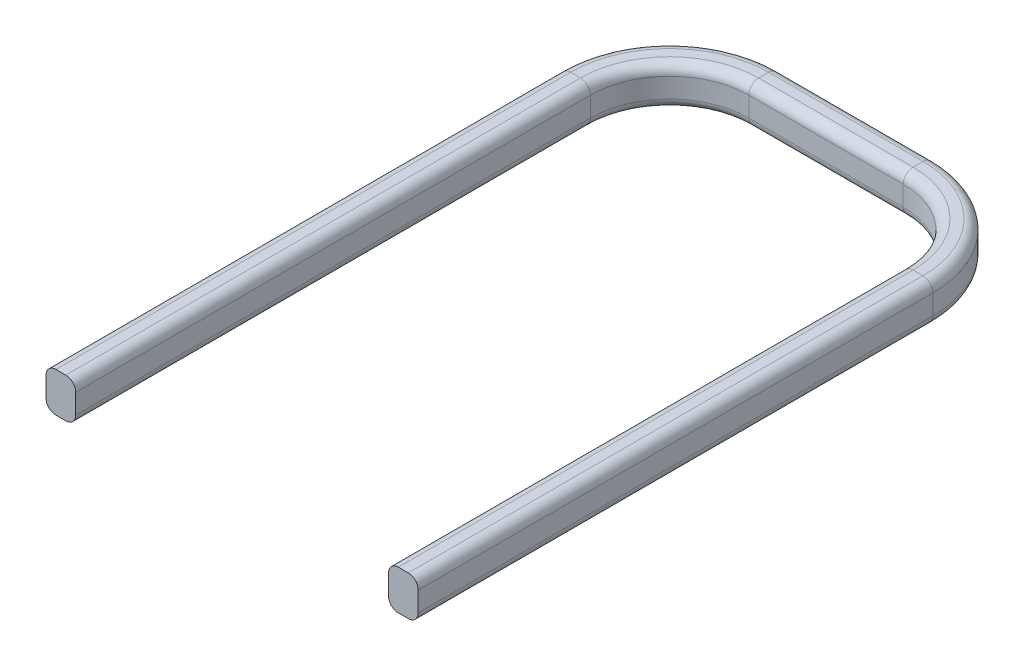
ISO-10303-21;
HEADER;
FILE_DESCRIPTION(('STEP AP214'),'2;1');
FILE_NAME('part.step','',(''),(''),'','','');
FILE_SCHEMA(('AUTOMOTIVE_DESIGN { 1 0 10303 214 1 1 1 1 }'));
ENDSEC;
DATA;
#1=APPLICATION_CONTEXT('core data for automotive mechanical design processes');
#2=APPLICATION_PROTOCOL_DEFINITION('international standard','automotive_design',2000,#1);
#3=PRODUCT_CONTEXT('',#1,'mechanical');
#4=PRODUCT('Part','Part','',(#3));
#5=PRODUCT_RELATED_PRODUCT_CATEGORY('part','',(#4));
#6=PRODUCT_DEFINITION_FORMATION('','',#4);
#7=PRODUCT_DEFINITION_CONTEXT('part definition',#1,'design');
#8=PRODUCT_DEFINITION('design','',#6,#7);
#9=PRODUCT_DEFINITION_SHAPE('','',#8);
#10=(LENGTH_UNIT() NAMED_UNIT(*) SI_UNIT(.MILLI.,.METRE.));
#11=(NAMED_UNIT(*) PLANE_ANGLE_UNIT() SI_UNIT($,.RADIAN.));
#12=(NAMED_UNIT(*) SI_UNIT($,.STERADIAN.) SOLID_ANGLE_UNIT());
#13=UNCERTAINTY_MEASURE_WITH_UNIT(LENGTH_MEASURE(1.E-05),#10,'distance_accuracy_value','');
#14=(GEOMETRIC_REPRESENTATION_CONTEXT(3) GLOBAL_UNCERTAINTY_ASSIGNED_CONTEXT((#13)) GLOBAL_UNIT_ASSIGNED_CONTEXT((#10,
#11,#12)) REPRESENTATION_CONTEXT('',''));
#15=CARTESIAN_POINT('',(0.,0.,0.));
#16=DIRECTION('',(0.,0.,1.));
#17=DIRECTION('',(1.,0.,0.));
#18=AXIS2_PLACEMENT_3D('',#15,#16,#17);
#19=CARTESIAN_POINT('',(0.,0.,0.));
#20=DIRECTION('',(0.,0.,1.));
#21=DIRECTION('',(1.,0.,0.));
#22=AXIS2_PLACEMENT_3D('',#19,#20,#21);
#23=PLANE('',#22);
#24=DIRECTION('',(1.,0.,0.));
#25=VECTOR('',#24,1.);
#26=CARTESIAN_POINT('',(-3.95,0.,0.));
#27=LINE('',#26,#25);
#28=CARTESIAN_POINT('',(-4.45,0.,0.));
#29=VERTEX_POINT('',#28);
#30=CARTESIAN_POINT('',(-4.2,0.,0.));
#31=VERTEX_POINT('',#30);
#32=EDGE_CURVE('E389',#29,#31,#27,.T.);
#33=ORIENTED_EDGE('',*,*,#32,.T.);
#34=CARTESIAN_POINT('',(-4.2,0.25,0.));
#35=DIRECTION('',(0.,0.,1.));
#36=DIRECTION('',(1.,0.,0.));
#37=AXIS2_PLACEMENT_3D('',#34,#35,#36);
#38=CIRCLE('',#37,0.25);
#39=CARTESIAN_POINT('',(-3.95,0.25,0.));
#40=VERTEX_POINT('',#39);
#41=EDGE_CURVE('E319',#31,#40,#38,.T.);
#42=ORIENTED_EDGE('',*,*,#41,.T.);
#43=DIRECTION('',(0.,1.,0.));
#44=VECTOR('',#43,1.);
#45=CARTESIAN_POINT('',(-3.95,0.,0.));
#46=LINE('',#45,#44);
#47=CARTESIAN_POINT('',(-3.95,0.75,0.));
#48=VERTEX_POINT('',#47);
#49=EDGE_CURVE('E332',#40,#48,#46,.T.);
#50=ORIENTED_EDGE('',*,*,#49,.T.);
#51=CARTESIAN_POINT('',(-4.2,0.75,0.));
#52=DIRECTION('',(0.,0.,1.));
#53=DIRECTION('',(1.,0.,0.));
#54=AXIS2_PLACEMENT_3D('',#51,#52,#53);
#55=CIRCLE('',#54,0.25);
#56=CARTESIAN_POINT('',(-4.2,1.,0.));
#57=VERTEX_POINT('',#56);
#58=EDGE_CURVE('E315',#48,#57,#55,.T.);
#59=ORIENTED_EDGE('',*,*,#58,.T.);
#60=DIRECTION('',(-1.,0.,0.));
#61=VECTOR('',#60,1.);
#62=CARTESIAN_POINT('',(-3.95,1.,0.));
#63=LINE('',#62,#61);
#64=CARTESIAN_POINT('',(-4.45,1.,0.));
#65=VERTEX_POINT('',#64);
#66=EDGE_CURVE('E380',#57,#65,#63,.T.);
#67=ORIENTED_EDGE('',*,*,#66,.T.);
#68=CARTESIAN_POINT('',(-4.45,0.75,0.));
#69=DIRECTION('',(0.,0.,1.));
#70=DIRECTION('',(1.,0.,0.));
#71=AXIS2_PLACEMENT_3D('',#68,#69,#70);
#72=CIRCLE('',#71,0.25);
#73=CARTESIAN_POINT('',(-4.7,0.75,0.));
#74=VERTEX_POINT('',#73);
#75=EDGE_CURVE('E57',#65,#74,#72,.T.);
#76=ORIENTED_EDGE('',*,*,#75,.T.);
#77=DIRECTION('',(0.,-1.,0.));
#78=VECTOR('',#77,1.);
#79=CARTESIAN_POINT('',(-4.7,0.,0.));
#80=LINE('',#79,#78);
#81=CARTESIAN_POINT('',(-4.7,0.25,0.));
#82=VERTEX_POINT('',#81);
#83=EDGE_CURVE('E387',#74,#82,#80,.T.);
#84=ORIENTED_EDGE('',*,*,#83,.T.);
#85=CARTESIAN_POINT('',(-4.45,0.25,0.));
#86=DIRECTION('',(0.,0.,1.));
#87=DIRECTION('',(1.,0.,0.));
#88=AXIS2_PLACEMENT_3D('',#85,#86,#87);
#89=CIRCLE('',#88,0.25);
#90=EDGE_CURVE('E317',#82,#29,#89,.T.);
#91=ORIENTED_EDGE('',*,*,#90,.T.);
#92=EDGE_LOOP('',(#33,#42,#50,#59,#67,#76,#84,#91));
#93=FACE_BOUND('',#92,.T.);
#94=ADVANCED_FACE('F33',(#93),#23,.T.);
#95=CARTESIAN_POINT('',(0.,0.,0.));
#96=DIRECTION('',(0.,0.,-1.));
#97=DIRECTION('',(-1.,0.,0.));
#98=AXIS2_PLACEMENT_3D('',#95,#96,#97);
#99=PLANE('',#98);
#100=DIRECTION('',(0.,1.,0.));
#101=VECTOR('',#100,1.);
#102=CARTESIAN_POINT('',(3.95,0.,0.));
#103=LINE('',#102,#101);
#104=CARTESIAN_POINT('',(3.95,0.25,0.));
#105=VERTEX_POINT('',#104);
#106=CARTESIAN_POINT('',(3.95,0.75,0.));
#107=VERTEX_POINT('',#106);
#108=EDGE_CURVE('E394',#105,#107,#103,.T.);
#109=ORIENTED_EDGE('',*,*,#108,.F.);
#110=CARTESIAN_POINT('',(4.2,0.25,0.));
#111=DIRECTION('',(0.,0.,-1.));
#112=DIRECTION('',(-1.,0.,0.));
#113=AXIS2_PLACEMENT_3D('',#110,#111,#112);
#114=CIRCLE('',#113,0.25);
#115=CARTESIAN_POINT('',(4.2,0.,0.));
#116=VERTEX_POINT('',#115);
#117=EDGE_CURVE('E235',#105,#116,#114,.F.);
#118=ORIENTED_EDGE('',*,*,#117,.T.);
#119=DIRECTION('',(-1.,0.,0.));
#120=VECTOR('',#119,1.);
#121=CARTESIAN_POINT('',(3.95,0.,0.));
#122=LINE('',#121,#120);
#123=CARTESIAN_POINT('',(4.45,0.,0.));
#124=VERTEX_POINT('',#123);
#125=EDGE_CURVE('E240',#124,#116,#122,.T.);
#126=ORIENTED_EDGE('',*,*,#125,.F.);
#127=CARTESIAN_POINT('',(4.45,0.25,0.));
#128=DIRECTION('',(0.,0.,-1.));
#129=DIRECTION('',(-1.,0.,0.));
#130=AXIS2_PLACEMENT_3D('',#127,#128,#129);
#131=CIRCLE('',#130,0.25);
#132=CARTESIAN_POINT('',(4.7,0.25,0.));
#133=VERTEX_POINT('',#132);
#134=EDGE_CURVE('E245',#124,#133,#131,.F.);
#135=ORIENTED_EDGE('',*,*,#134,.T.);
#136=DIRECTION('',(0.,-1.,0.));
#137=VECTOR('',#136,1.);
#138=CARTESIAN_POINT('',(4.7,0.,0.));
#139=LINE('',#138,#137);
#140=CARTESIAN_POINT('',(4.7,0.75,0.));
#141=VERTEX_POINT('',#140);
#142=EDGE_CURVE('E412',#141,#133,#139,.T.);
#143=ORIENTED_EDGE('',*,*,#142,.F.);
#144=CARTESIAN_POINT('',(4.45,0.75,0.));
#145=DIRECTION('',(0.,0.,-1.));
#146=DIRECTION('',(-1.,0.,0.));
#147=AXIS2_PLACEMENT_3D('',#144,#145,#146);
#148=CIRCLE('',#147,0.25);
#149=CARTESIAN_POINT('',(4.45,1.,0.));
#150=VERTEX_POINT('',#149);
#151=EDGE_CURVE('E236',#141,#150,#148,.F.);
#152=ORIENTED_EDGE('',*,*,#151,.T.);
#153=DIRECTION('',(1.,0.,0.));
#154=VECTOR('',#153,1.);
#155=CARTESIAN_POINT('',(3.95,1.,0.));
#156=LINE('',#155,#154);
#157=CARTESIAN_POINT('',(4.2,1.,0.));
#158=VERTEX_POINT('',#157);
#159=EDGE_CURVE('E410',#158,#150,#156,.T.);
#160=ORIENTED_EDGE('',*,*,#159,.F.);
#161=CARTESIAN_POINT('',(4.2,0.75,0.));
#162=DIRECTION('',(0.,0.,-1.));
#163=DIRECTION('',(-1.,0.,0.));
#164=AXIS2_PLACEMENT_3D('',#161,#162,#163);
#165=CIRCLE('',#164,0.25);
#166=EDGE_CURVE('E238',#158,#107,#165,.F.);
#167=ORIENTED_EDGE('',*,*,#166,.T.);
#168=EDGE_LOOP('',(#109,#118,#126,#135,#143,#152,#160,#167));
#169=FACE_BOUND('',#168,.T.);
#170=ADVANCED_FACE('F441',(#169),#99,.F.);
#171=CARTESIAN_POINT('',(-3.95,0.,0.));
#172=DIRECTION('',(-1.,0.,0.));
#173=DIRECTION('',(0.,0.,1.));
#174=AXIS2_PLACEMENT_3D('',#171,#172,#173);
#175=PLANE('',#174);
#176=ORIENTED_EDGE('',*,*,#49,.F.);
#177=DIRECTION('',(0.,0.,-1.));
#178=VECTOR('',#177,1.);
#179=CARTESIAN_POINT('',(-3.95,0.25,0.));
#180=LINE('',#179,#178);
#181=CARTESIAN_POINT('',(-3.95,0.25,-13.));
#182=VERTEX_POINT('',#181);
#183=EDGE_CURVE('E308',#40,#182,#180,.T.);
#184=ORIENTED_EDGE('',*,*,#183,.T.);
#185=DIRECTION('',(0.,1.,0.));
#186=VECTOR('',#185,1.);
#187=CARTESIAN_POINT('',(-3.95,0.,-13.));
#188=LINE('',#187,#186);
#189=CARTESIAN_POINT('',(-3.95,0.75,-13.));
#190=VERTEX_POINT('',#189);
#191=EDGE_CURVE('E397',#182,#190,#188,.T.);
#192=ORIENTED_EDGE('',*,*,#191,.T.);
#193=DIRECTION('',(0.,0.,-1.));
#194=VECTOR('',#193,1.);
#195=CARTESIAN_POINT('',(-3.95,0.75,0.));
#196=LINE('',#195,#194);
#197=EDGE_CURVE('E306',#190,#48,#196,.F.);
#198=ORIENTED_EDGE('',*,*,#197,.T.);
#199=EDGE_LOOP('',(#176,#184,#192,#198));
#200=FACE_BOUND('',#199,.T.);
#201=ADVANCED_FACE('F476',(#200),#175,.F.);
#202=CARTESIAN_POINT('',(-3.95,1.,0.));
#203=DIRECTION('',(0.,-1.,0.));
#204=DIRECTION('',(1.,0.,0.));
#205=AXIS2_PLACEMENT_3D('',#202,#203,#204);
#206=PLANE('',#205);
#207=ORIENTED_EDGE('',*,*,#66,.F.);
#208=DIRECTION('',(0.,0.,-1.));
#209=VECTOR('',#208,1.);
#210=CARTESIAN_POINT('',(-4.2,1.,0.));
#211=LINE('',#210,#209);
#212=CARTESIAN_POINT('',(-4.2,1.,-13.));
#213=VERTEX_POINT('',#212);
#214=EDGE_CURVE('E11',#57,#213,#211,.T.);
#215=ORIENTED_EDGE('',*,*,#214,.T.);
#216=DIRECTION('',(-1.,0.,0.));
#217=VECTOR('',#216,1.);
#218=CARTESIAN_POINT('',(-3.95,1.,-13.));
#219=LINE('',#218,#217);
#220=CARTESIAN_POINT('',(-4.45,1.,-13.));
#221=VERTEX_POINT('',#220);
#222=EDGE_CURVE('E383',#213,#221,#219,.T.);
#223=ORIENTED_EDGE('',*,*,#222,.T.);
#224=DIRECTION('',(0.,0.,-1.));
#225=VECTOR('',#224,1.);
#226=CARTESIAN_POINT('',(-4.45,1.,0.));
#227=LINE('',#226,#225);
#228=EDGE_CURVE('E42',#221,#65,#227,.F.);
#229=ORIENTED_EDGE('',*,*,#228,.T.);
#230=EDGE_LOOP('',(#207,#215,#223,#229));
#231=FACE_BOUND('',#230,.T.);
#232=ADVANCED_FACE('F379',(#231),#206,.F.);
#233=CARTESIAN_POINT('',(-4.7,0.,0.));
#234=DIRECTION('',(1.,0.,0.));
#235=DIRECTION('',(0.,0.,-1.));
#236=AXIS2_PLACEMENT_3D('',#233,#234,#235);
#237=PLANE('',#236);
#238=DIRECTION('',(0.,-1.,0.));
#239=VECTOR('',#238,1.);
#240=CARTESIAN_POINT('',(-4.7,0.,-13.));
#241=LINE('',#240,#239);
#242=CARTESIAN_POINT('',(-4.7,0.75,-13.));
#243=VERTEX_POINT('',#242);
#244=CARTESIAN_POINT('',(-4.7,0.25,-13.));
#245=VERTEX_POINT('',#244);
#246=EDGE_CURVE('E396',#243,#245,#241,.T.);
#247=ORIENTED_EDGE('',*,*,#246,.T.);
#248=DIRECTION('',(0.,0.,-1.));
#249=VECTOR('',#248,1.);
#250=CARTESIAN_POINT('',(-4.7,0.25,0.));
#251=LINE('',#250,#249);
#252=EDGE_CURVE('E50',#245,#82,#251,.F.);
#253=ORIENTED_EDGE('',*,*,#252,.T.);
#254=ORIENTED_EDGE('',*,*,#83,.F.);
#255=DIRECTION('',(0.,0.,-1.));
#256=VECTOR('',#255,1.);
#257=CARTESIAN_POINT('',(-4.7,0.75,0.));
#258=LINE('',#257,#256);
#259=EDGE_CURVE('E321',#74,#243,#258,.T.);
#260=ORIENTED_EDGE('',*,*,#259,.T.);
#261=EDGE_LOOP('',(#247,#253,#254,#260));
#262=FACE_BOUND('',#261,.T.);
#263=ADVANCED_FACE('F526',(#262),#237,.F.);
#264=CARTESIAN_POINT('',(-3.95,0.,0.));
#265=DIRECTION('',(0.,1.,0.));
#266=DIRECTION('',(-1.,0.,0.));
#267=AXIS2_PLACEMENT_3D('',#264,#265,#266);
#268=PLANE('',#267);
#269=DIRECTION('',(1.,0.,0.));
#270=VECTOR('',#269,1.);
#271=CARTESIAN_POINT('',(-3.95,0.,-13.));
#272=LINE('',#271,#270);
#273=CARTESIAN_POINT('',(-4.45,0.,-13.));
#274=VERTEX_POINT('',#273);
#275=CARTESIAN_POINT('',(-4.2,0.,-13.));
#276=VERTEX_POINT('',#275);
#277=EDGE_CURVE('E415',#274,#276,#272,.T.);
#278=ORIENTED_EDGE('',*,*,#277,.T.);
#279=DIRECTION('',(0.,0.,-1.));
#280=VECTOR('',#279,1.);
#281=CARTESIAN_POINT('',(-4.2,0.,0.));
#282=LINE('',#281,#280);
#283=EDGE_CURVE('E312',#276,#31,#282,.F.);
#284=ORIENTED_EDGE('',*,*,#283,.T.);
#285=ORIENTED_EDGE('',*,*,#32,.F.);
#286=DIRECTION('',(0.,0.,-1.));
#287=VECTOR('',#286,1.);
#288=CARTESIAN_POINT('',(-4.45,0.,0.));
#289=LINE('',#288,#287);
#290=EDGE_CURVE('E310',#29,#274,#289,.T.);
#291=ORIENTED_EDGE('',*,*,#290,.T.);
#292=EDGE_LOOP('',(#278,#284,#285,#291));
#293=FACE_BOUND('',#292,.T.);
#294=ADVANCED_FACE('F534',(#293),#268,.F.);
#295=CARTESIAN_POINT('',(-1.95,0.,-13.));
#296=DIRECTION('',(0.,-1.,0.));
#297=DIRECTION('',(0.,0.,-1.));
#298=AXIS2_PLACEMENT_3D('',#295,#296,#297);
#299=CYLINDRICAL_SURFACE('',#298,2.);
#300=ORIENTED_EDGE('',*,*,#191,.F.);
#301=CARTESIAN_POINT('',(-1.95,0.25,-13.));
#302=DIRECTION('',(0.,1.,0.));
#303=DIRECTION('',(0.,0.,1.));
#304=AXIS2_PLACEMENT_3D('',#301,#302,#303);
#305=CIRCLE('',#304,2.);
#306=CARTESIAN_POINT('',(-1.95,0.25,-15.));
#307=VERTEX_POINT('',#306);
#308=EDGE_CURVE('E266',#182,#307,#305,.F.);
#309=ORIENTED_EDGE('',*,*,#308,.T.);
#310=DIRECTION('',(0.,1.,0.));
#311=VECTOR('',#310,1.);
#312=CARTESIAN_POINT('',(-1.95,0.,-15.));
#313=LINE('',#312,#311);
#314=CARTESIAN_POINT('',(-1.95,0.75,-15.));
#315=VERTEX_POINT('',#314);
#316=EDGE_CURVE('E402',#307,#315,#313,.T.);
#317=ORIENTED_EDGE('',*,*,#316,.T.);
#318=CARTESIAN_POINT('',(-1.95,0.75,-13.));
#319=DIRECTION('',(0.,-1.,0.));
#320=DIRECTION('',(0.,0.,-1.));
#321=AXIS2_PLACEMENT_3D('',#318,#319,#320);
#322=CIRCLE('',#321,2.);
#323=EDGE_CURVE('E264',#315,#190,#322,.F.);
#324=ORIENTED_EDGE('',*,*,#323,.T.);
#325=EDGE_LOOP('',(#300,#309,#317,#324));
#326=FACE_BOUND('',#325,.T.);
#327=ADVANCED_FACE('F471',(#326),#299,.F.);
#328=CARTESIAN_POINT('',(-3.95,1.,-13.));
#329=DIRECTION('',(0.,-1.,0.));
#330=DIRECTION('',(0.,0.,-1.));
#331=AXIS2_PLACEMENT_3D('',#328,#329,#330);
#332=PLANE('',#331);
#333=ORIENTED_EDGE('',*,*,#222,.F.);
#334=CARTESIAN_POINT('',(-1.95,1.,-13.));
#335=DIRECTION('',(0.,-1.,0.));
#336=DIRECTION('',(0.,0.,-1.));
#337=AXIS2_PLACEMENT_3D('',#334,#335,#336);
#338=CIRCLE('',#337,2.25);
#339=CARTESIAN_POINT('',(-1.95,1.,-15.25));
#340=VERTEX_POINT('',#339);
#341=EDGE_CURVE('E304',#213,#340,#338,.T.);
#342=ORIENTED_EDGE('',*,*,#341,.T.);
#343=DIRECTION('',(0.,0.,-1.));
#344=VECTOR('',#343,1.);
#345=CARTESIAN_POINT('',(-1.95,1.,-15.));
#346=LINE('',#345,#344);
#347=CARTESIAN_POINT('',(-1.95,1.,-15.5));
#348=VERTEX_POINT('',#347);
#349=EDGE_CURVE('E398',#340,#348,#346,.T.);
#350=ORIENTED_EDGE('',*,*,#349,.T.);
#351=CARTESIAN_POINT('',(-1.95,1.,-13.));
#352=DIRECTION('',(0.,-1.,0.));
#353=DIRECTION('',(0.,0.,-1.));
#354=AXIS2_PLACEMENT_3D('',#351,#352,#353);
#355=CIRCLE('',#354,2.5);
#356=EDGE_CURVE('E302',#348,#221,#355,.F.);
#357=ORIENTED_EDGE('',*,*,#356,.T.);
#358=EDGE_LOOP('',(#333,#342,#350,#357));
#359=FACE_BOUND('',#358,.T.);
#360=ADVANCED_FACE('F482',(#359),#332,.F.);
#361=CARTESIAN_POINT('',(-1.95,0.,-13.));
#362=DIRECTION('',(0.,-1.,0.));
#363=DIRECTION('',(0.,0.,-1.));
#364=AXIS2_PLACEMENT_3D('',#361,#362,#363);
#365=CYLINDRICAL_SURFACE('',#364,2.75);
#366=DIRECTION('',(0.,-1.,0.));
#367=VECTOR('',#366,1.);
#368=CARTESIAN_POINT('',(-1.95,0.,-15.75));
#369=LINE('',#368,#367);
#370=CARTESIAN_POINT('',(-1.95,0.75,-15.75));
#371=VERTEX_POINT('',#370);
#372=CARTESIAN_POINT('',(-1.95,0.25,-15.75));
#373=VERTEX_POINT('',#372);
#374=EDGE_CURVE('E401',#371,#373,#369,.T.);
#375=ORIENTED_EDGE('',*,*,#374,.T.);
#376=CARTESIAN_POINT('',(-1.95,0.25,-13.));
#377=DIRECTION('',(0.,1.,0.));
#378=DIRECTION('',(0.,0.,1.));
#379=AXIS2_PLACEMENT_3D('',#376,#377,#378);
#380=CIRCLE('',#379,2.75);
#381=EDGE_CURVE('E287',#373,#245,#380,.T.);
#382=ORIENTED_EDGE('',*,*,#381,.T.);
#383=ORIENTED_EDGE('',*,*,#246,.F.);
#384=CARTESIAN_POINT('',(-1.95,0.75,-13.));
#385=DIRECTION('',(0.,-1.,0.));
#386=DIRECTION('',(0.,0.,-1.));
#387=AXIS2_PLACEMENT_3D('',#384,#385,#386);
#388=CIRCLE('',#387,2.75);
#389=EDGE_CURVE('E285',#243,#371,#388,.T.);
#390=ORIENTED_EDGE('',*,*,#389,.T.);
#391=EDGE_LOOP('',(#375,#382,#383,#390));
#392=FACE_BOUND('',#391,.T.);
#393=ADVANCED_FACE('F525',(#392),#365,.T.);
#394=CARTESIAN_POINT('',(-3.95,0.,-13.));
#395=DIRECTION('',(0.,1.,0.));
#396=DIRECTION('',(0.,0.,1.));
#397=AXIS2_PLACEMENT_3D('',#394,#395,#396);
#398=PLANE('',#397);
#399=DIRECTION('',(0.,0.,1.));
#400=VECTOR('',#399,1.);
#401=CARTESIAN_POINT('',(-1.95,0.,-15.));
#402=LINE('',#401,#400);
#403=CARTESIAN_POINT('',(-1.95,0.,-15.5));
#404=VERTEX_POINT('',#403);
#405=CARTESIAN_POINT('',(-1.95,0.,-15.25));
#406=VERTEX_POINT('',#405);
#407=EDGE_CURVE('E418',#404,#406,#402,.T.);
#408=ORIENTED_EDGE('',*,*,#407,.T.);
#409=CARTESIAN_POINT('',(-1.95,0.,-13.));
#410=DIRECTION('',(0.,1.,0.));
#411=DIRECTION('',(0.,0.,1.));
#412=AXIS2_PLACEMENT_3D('',#409,#410,#411);
#413=CIRCLE('',#412,2.25);
#414=EDGE_CURVE('E270',#406,#276,#413,.T.);
#415=ORIENTED_EDGE('',*,*,#414,.T.);
#416=ORIENTED_EDGE('',*,*,#277,.F.);
#417=CARTESIAN_POINT('',(-1.95,0.,-13.));
#418=DIRECTION('',(0.,1.,0.));
#419=DIRECTION('',(0.,0.,1.));
#420=AXIS2_PLACEMENT_3D('',#417,#418,#419);
#421=CIRCLE('',#420,2.5);
#422=EDGE_CURVE('E268',#274,#404,#421,.F.);
#423=ORIENTED_EDGE('',*,*,#422,.T.);
#424=EDGE_LOOP('',(#408,#415,#416,#423));
#425=FACE_BOUND('',#424,.T.);
#426=ADVANCED_FACE('F553',(#425),#398,.F.);
#427=CARTESIAN_POINT('',(-1.95,0.,-15.));
#428=DIRECTION('',(0.,0.,-1.));
#429=DIRECTION('',(-1.,0.,0.));
#430=AXIS2_PLACEMENT_3D('',#427,#428,#429);
#431=PLANE('',#430);
#432=ORIENTED_EDGE('',*,*,#316,.F.);
#433=DIRECTION('',(1.,0.,0.));
#434=VECTOR('',#433,1.);
#435=CARTESIAN_POINT('',(-1.95,0.25,-15.));
#436=LINE('',#435,#434);
#437=CARTESIAN_POINT('',(1.95,0.25,-15.));
#438=VERTEX_POINT('',#437);
#439=EDGE_CURVE('E258',#307,#438,#436,.T.);
#440=ORIENTED_EDGE('',*,*,#439,.T.);
#441=DIRECTION('',(0.,1.,0.));
#442=VECTOR('',#441,1.);
#443=CARTESIAN_POINT('',(1.95,0.,-15.));
#444=LINE('',#443,#442);
#445=CARTESIAN_POINT('',(1.95,0.75,-15.));
#446=VERTEX_POINT('',#445);
#447=EDGE_CURVE('E204',#438,#446,#444,.T.);
#448=ORIENTED_EDGE('',*,*,#447,.T.);
#449=DIRECTION('',(1.,0.,0.));
#450=VECTOR('',#449,1.);
#451=CARTESIAN_POINT('',(-1.95,0.75,-15.));
#452=LINE('',#451,#450);
#453=EDGE_CURVE('E256',#446,#315,#452,.F.);
#454=ORIENTED_EDGE('',*,*,#453,.T.);
#455=EDGE_LOOP('',(#432,#440,#448,#454));
#456=FACE_BOUND('',#455,.T.);
#457=ADVANCED_FACE('F455',(#456),#431,.F.);
#458=CARTESIAN_POINT('',(-1.95,1.,-15.));
#459=DIRECTION('',(0.,-1.,0.));
#460=DIRECTION('',(0.,0.,-1.));
#461=AXIS2_PLACEMENT_3D('',#458,#459,#460);
#462=PLANE('',#461);
#463=ORIENTED_EDGE('',*,*,#349,.F.);
#464=DIRECTION('',(1.,0.,0.));
#465=VECTOR('',#464,1.);
#466=CARTESIAN_POINT('',(-1.95,1.,-15.25));
#467=LINE('',#466,#465);
#468=CARTESIAN_POINT('',(1.95,1.,-15.25));
#469=VERTEX_POINT('',#468);
#470=EDGE_CURVE('E300',#340,#469,#467,.T.);
#471=ORIENTED_EDGE('',*,*,#470,.T.);
#472=DIRECTION('',(0.,0.,-1.));
#473=VECTOR('',#472,1.);
#474=CARTESIAN_POINT('',(1.95,1.,-15.));
#475=LINE('',#474,#473);
#476=CARTESIAN_POINT('',(1.95,1.,-15.5));
#477=VERTEX_POINT('',#476);
#478=EDGE_CURVE('E403',#469,#477,#475,.T.);
#479=ORIENTED_EDGE('',*,*,#478,.T.);
#480=DIRECTION('',(1.,0.,0.));
#481=VECTOR('',#480,1.);
#482=CARTESIAN_POINT('',(-1.95,1.,-15.5));
#483=LINE('',#482,#481);
#484=EDGE_CURVE('E298',#477,#348,#483,.F.);
#485=ORIENTED_EDGE('',*,*,#484,.T.);
#486=EDGE_LOOP('',(#463,#471,#479,#485));
#487=FACE_BOUND('',#486,.T.);
#488=ADVANCED_FACE('F485',(#487),#462,.F.);
#489=CARTESIAN_POINT('',(-1.95,0.,-15.75));
#490=DIRECTION('',(0.,0.,1.));
#491=DIRECTION('',(1.,0.,0.));
#492=AXIS2_PLACEMENT_3D('',#489,#490,#491);
#493=PLANE('',#492);
#494=DIRECTION('',(0.,-1.,0.));
#495=VECTOR('',#494,1.);
#496=CARTESIAN_POINT('',(1.95,0.,-15.75));
#497=LINE('',#496,#495);
#498=CARTESIAN_POINT('',(1.95,0.75,-15.75));
#499=VERTEX_POINT('',#498);
#500=CARTESIAN_POINT('',(1.95,0.25,-15.75));
#501=VERTEX_POINT('',#500);
#502=EDGE_CURVE('E406',#499,#501,#497,.T.);
#503=ORIENTED_EDGE('',*,*,#502,.T.);
#504=DIRECTION('',(1.,0.,0.));
#505=VECTOR('',#504,1.);
#506=CARTESIAN_POINT('',(-1.95,0.25,-15.75));
#507=LINE('',#506,#505);
#508=EDGE_CURVE('E283',#501,#373,#507,.F.);
#509=ORIENTED_EDGE('',*,*,#508,.T.);
#510=ORIENTED_EDGE('',*,*,#374,.F.);
#511=DIRECTION('',(1.,0.,0.));
#512=VECTOR('',#511,1.);
#513=CARTESIAN_POINT('',(-1.95,0.75,-15.75));
#514=LINE('',#513,#512);
#515=EDGE_CURVE('E281',#371,#499,#514,.T.);
#516=ORIENTED_EDGE('',*,*,#515,.T.);
#517=EDGE_LOOP('',(#503,#509,#510,#516));
#518=FACE_BOUND('',#517,.T.);
#519=ADVANCED_FACE('F512',(#518),#493,.F.);
#520=CARTESIAN_POINT('',(-1.95,0.,-15.));
#521=DIRECTION('',(0.,1.,0.));
#522=DIRECTION('',(0.,0.,1.));
#523=AXIS2_PLACEMENT_3D('',#520,#521,#522);
#524=PLANE('',#523);
#525=DIRECTION('',(0.,0.,1.));
#526=VECTOR('',#525,1.);
#527=CARTESIAN_POINT('',(1.95,0.,-15.));
#528=LINE('',#527,#526);
#529=CARTESIAN_POINT('',(1.95,0.,-15.5));
#530=VERTEX_POINT('',#529);
#531=CARTESIAN_POINT('',(1.95,0.,-15.25));
#532=VERTEX_POINT('',#531);
#533=EDGE_CURVE('E222',#530,#532,#528,.T.);
#534=ORIENTED_EDGE('',*,*,#533,.T.);
#535=DIRECTION('',(1.,0.,0.));
#536=VECTOR('',#535,1.);
#537=CARTESIAN_POINT('',(-1.95,0.,-15.25));
#538=LINE('',#537,#536);
#539=EDGE_CURVE('E262',#532,#406,#538,.F.);
#540=ORIENTED_EDGE('',*,*,#539,.T.);
#541=ORIENTED_EDGE('',*,*,#407,.F.);
#542=DIRECTION('',(1.,0.,0.));
#543=VECTOR('',#542,1.);
#544=CARTESIAN_POINT('',(-1.95,0.,-15.5));
#545=LINE('',#544,#543);
#546=EDGE_CURVE('E260',#404,#530,#545,.T.);
#547=ORIENTED_EDGE('',*,*,#546,.T.);
#548=EDGE_LOOP('',(#534,#540,#541,#547));
#549=FACE_BOUND('',#548,.T.);
#550=ADVANCED_FACE('F550',(#549),#524,.F.);
#551=CARTESIAN_POINT('',(1.95,0.,-13.));
#552=DIRECTION('',(0.,-1.,0.));
#553=DIRECTION('',(0.,0.,-1.));
#554=AXIS2_PLACEMENT_3D('',#551,#552,#553);
#555=CYLINDRICAL_SURFACE('',#554,2.);
#556=ORIENTED_EDGE('',*,*,#447,.F.);
#557=CARTESIAN_POINT('',(1.95,0.25,-13.));
#558=DIRECTION('',(0.,1.,0.));
#559=DIRECTION('',(0.,0.,1.));
#560=AXIS2_PLACEMENT_3D('',#557,#558,#559);
#561=CIRCLE('',#560,2.);
#562=CARTESIAN_POINT('',(3.95,0.25,-13.));
#563=VERTEX_POINT('',#562);
#564=EDGE_CURVE('E198',#438,#563,#561,.F.);
#565=ORIENTED_EDGE('',*,*,#564,.T.);
#566=DIRECTION('',(0.,1.,0.));
#567=VECTOR('',#566,1.);
#568=CARTESIAN_POINT('',(3.95,0.,-13.));
#569=LINE('',#568,#567);
#570=CARTESIAN_POINT('',(3.95,0.75,-13.));
#571=VERTEX_POINT('',#570);
#572=EDGE_CURVE('E201',#563,#571,#569,.T.);
#573=ORIENTED_EDGE('',*,*,#572,.T.);
#574=CARTESIAN_POINT('',(1.95,0.75,-13.));
#575=DIRECTION('',(0.,-1.,0.));
#576=DIRECTION('',(0.,0.,-1.));
#577=AXIS2_PLACEMENT_3D('',#574,#575,#576);
#578=CIRCLE('',#577,2.);
#579=EDGE_CURVE('E210',#571,#446,#578,.F.);
#580=ORIENTED_EDGE('',*,*,#579,.T.);
#581=EDGE_LOOP('',(#556,#565,#573,#580));
#582=FACE_BOUND('',#581,.T.);
#583=ADVANCED_FACE('F200',(#582),#555,.F.);
#584=CARTESIAN_POINT('',(1.95,1.,-15.));
#585=DIRECTION('',(0.,-1.,0.));
#586=DIRECTION('',(0.,0.,-1.));
#587=AXIS2_PLACEMENT_3D('',#584,#585,#586);
#588=PLANE('',#587);
#589=ORIENTED_EDGE('',*,*,#478,.F.);
#590=CARTESIAN_POINT('',(1.95,1.,-13.));
#591=DIRECTION('',(0.,-1.,0.));
#592=DIRECTION('',(0.,0.,-1.));
#593=AXIS2_PLACEMENT_3D('',#590,#591,#592);
#594=CIRCLE('',#593,2.25);
#595=CARTESIAN_POINT('',(4.2,1.,-13.));
#596=VERTEX_POINT('',#595);
#597=EDGE_CURVE('E296',#469,#596,#594,.T.);
#598=ORIENTED_EDGE('',*,*,#597,.T.);
#599=DIRECTION('',(1.,0.,0.));
#600=VECTOR('',#599,1.);
#601=CARTESIAN_POINT('',(3.95,1.,-13.));
#602=LINE('',#601,#600);
#603=CARTESIAN_POINT('',(4.45,1.,-13.));
#604=VERTEX_POINT('',#603);
#605=EDGE_CURVE('E221',#596,#604,#602,.T.);
#606=ORIENTED_EDGE('',*,*,#605,.T.);
#607=CARTESIAN_POINT('',(1.95,1.,-13.));
#608=DIRECTION('',(0.,-1.,0.));
#609=DIRECTION('',(0.,0.,-1.));
#610=AXIS2_PLACEMENT_3D('',#607,#608,#609);
#611=CIRCLE('',#610,2.5);
#612=EDGE_CURVE('E294',#604,#477,#611,.F.);
#613=ORIENTED_EDGE('',*,*,#612,.T.);
#614=EDGE_LOOP('',(#589,#598,#606,#613));
#615=FACE_BOUND('',#614,.T.);
#616=ADVANCED_FACE('F725',(#615),#588,.F.);
#617=CARTESIAN_POINT('',(1.95,0.,-13.));
#618=DIRECTION('',(0.,-1.,0.));
#619=DIRECTION('',(0.,0.,-1.));
#620=AXIS2_PLACEMENT_3D('',#617,#618,#619);
#621=CYLINDRICAL_SURFACE('',#620,2.75);
#622=DIRECTION('',(0.,-1.,0.));
#623=VECTOR('',#622,1.);
#624=CARTESIAN_POINT('',(4.7,0.,-13.));
#625=LINE('',#624,#623);
#626=CARTESIAN_POINT('',(4.7,0.75,-13.));
#627=VERTEX_POINT('',#626);
#628=CARTESIAN_POINT('',(4.7,0.25,-13.));
#629=VERTEX_POINT('',#628);
#630=EDGE_CURVE('E409',#627,#629,#625,.T.);
#631=ORIENTED_EDGE('',*,*,#630,.T.);
#632=CARTESIAN_POINT('',(1.95,0.25,-13.));
#633=DIRECTION('',(0.,1.,0.));
#634=DIRECTION('',(0.,0.,1.));
#635=AXIS2_PLACEMENT_3D('',#632,#633,#634);
#636=CIRCLE('',#635,2.75);
#637=EDGE_CURVE('E279',#629,#501,#636,.T.);
#638=ORIENTED_EDGE('',*,*,#637,.T.);
#639=ORIENTED_EDGE('',*,*,#502,.F.);
#640=CARTESIAN_POINT('',(1.95,0.75,-13.));
#641=DIRECTION('',(0.,-1.,0.));
#642=DIRECTION('',(0.,0.,-1.));
#643=AXIS2_PLACEMENT_3D('',#640,#641,#642);
#644=CIRCLE('',#643,2.75);
#645=EDGE_CURVE('E277',#499,#627,#644,.T.);
#646=ORIENTED_EDGE('',*,*,#645,.T.);
#647=EDGE_LOOP('',(#631,#638,#639,#646));
#648=FACE_BOUND('',#647,.T.);
#649=ADVANCED_FACE('F498',(#648),#621,.T.);
#650=CARTESIAN_POINT('',(1.95,0.,-15.));
#651=DIRECTION('',(0.,1.,0.));
#652=DIRECTION('',(0.,0.,1.));
#653=AXIS2_PLACEMENT_3D('',#650,#651,#652);
#654=PLANE('',#653);
#655=DIRECTION('',(-1.,0.,0.));
#656=VECTOR('',#655,1.);
#657=CARTESIAN_POINT('',(3.95,0.,-13.));
#658=LINE('',#657,#656);
#659=CARTESIAN_POINT('',(4.45,0.,-13.));
#660=VERTEX_POINT('',#659);
#661=CARTESIAN_POINT('',(4.2,0.,-13.));
#662=VERTEX_POINT('',#661);
#663=EDGE_CURVE('E423',#660,#662,#658,.T.);
#664=ORIENTED_EDGE('',*,*,#663,.T.);
#665=CARTESIAN_POINT('',(1.95,0.,-13.));
#666=DIRECTION('',(0.,1.,0.));
#667=DIRECTION('',(0.,0.,1.));
#668=AXIS2_PLACEMENT_3D('',#665,#666,#667);
#669=CIRCLE('',#668,2.25);
#670=EDGE_CURVE('E228',#662,#532,#669,.T.);
#671=ORIENTED_EDGE('',*,*,#670,.T.);
#672=ORIENTED_EDGE('',*,*,#533,.F.);
#673=CARTESIAN_POINT('',(1.95,0.,-13.));
#674=DIRECTION('',(0.,1.,0.));
#675=DIRECTION('',(0.,0.,1.));
#676=AXIS2_PLACEMENT_3D('',#673,#674,#675);
#677=CIRCLE('',#676,2.5);
#678=EDGE_CURVE('E209',#530,#660,#677,.F.);
#679=ORIENTED_EDGE('',*,*,#678,.T.);
#680=EDGE_LOOP('',(#664,#671,#672,#679));
#681=FACE_BOUND('',#680,.T.);
#682=ADVANCED_FACE('F575',(#681),#654,.F.);
#683=CARTESIAN_POINT('',(3.95,0.,-13.));
#684=DIRECTION('',(1.,0.,0.));
#685=DIRECTION('',(0.,0.,-1.));
#686=AXIS2_PLACEMENT_3D('',#683,#684,#685);
#687=PLANE('',#686);
#688=ORIENTED_EDGE('',*,*,#572,.F.);
#689=DIRECTION('',(0.,0.,1.));
#690=VECTOR('',#689,1.);
#691=CARTESIAN_POINT('',(3.95,0.25,-13.));
#692=LINE('',#691,#690);
#693=EDGE_CURVE('E217',#563,#105,#692,.T.);
#694=ORIENTED_EDGE('',*,*,#693,.T.);
#695=ORIENTED_EDGE('',*,*,#108,.T.);
#696=DIRECTION('',(0.,0.,1.));
#697=VECTOR('',#696,1.);
#698=CARTESIAN_POINT('',(3.95,0.75,-13.));
#699=LINE('',#698,#697);
#700=EDGE_CURVE('E220',#107,#571,#699,.F.);
#701=ORIENTED_EDGE('',*,*,#700,.T.);
#702=EDGE_LOOP('',(#688,#694,#695,#701));
#703=FACE_BOUND('',#702,.T.);
#704=ADVANCED_FACE('F214',(#703),#687,.F.);
#705=CARTESIAN_POINT('',(3.95,1.,-13.));
#706=DIRECTION('',(0.,-1.,0.));
#707=DIRECTION('',(1.,0.,0.));
#708=AXIS2_PLACEMENT_3D('',#705,#706,#707);
#709=PLANE('',#708);
#710=ORIENTED_EDGE('',*,*,#605,.F.);
#711=DIRECTION('',(0.,0.,1.));
#712=VECTOR('',#711,1.);
#713=CARTESIAN_POINT('',(4.2,1.,-13.));
#714=LINE('',#713,#712);
#715=EDGE_CURVE('E291',#596,#158,#714,.T.);
#716=ORIENTED_EDGE('',*,*,#715,.T.);
#717=ORIENTED_EDGE('',*,*,#159,.T.);
#718=DIRECTION('',(0.,0.,1.));
#719=VECTOR('',#718,1.);
#720=CARTESIAN_POINT('',(4.45,1.,-13.));
#721=LINE('',#720,#719);
#722=EDGE_CURVE('E289',#150,#604,#721,.F.);
#723=ORIENTED_EDGE('',*,*,#722,.T.);
#724=EDGE_LOOP('',(#710,#716,#717,#723));
#725=FACE_BOUND('',#724,.T.);
#726=ADVANCED_FACE('F571',(#725),#709,.F.);
#727=CARTESIAN_POINT('',(4.7,0.,-13.));
#728=DIRECTION('',(-1.,0.,0.));
#729=DIRECTION('',(0.,0.,1.));
#730=AXIS2_PLACEMENT_3D('',#727,#728,#729);
#731=PLANE('',#730);
#732=ORIENTED_EDGE('',*,*,#142,.T.);
#733=DIRECTION('',(0.,0.,1.));
#734=VECTOR('',#733,1.);
#735=CARTESIAN_POINT('',(4.7,0.25,-13.));
#736=LINE('',#735,#734);
#737=EDGE_CURVE('E275',#133,#629,#736,.F.);
#738=ORIENTED_EDGE('',*,*,#737,.T.);
#739=ORIENTED_EDGE('',*,*,#630,.F.);
#740=DIRECTION('',(0.,0.,1.));
#741=VECTOR('',#740,1.);
#742=CARTESIAN_POINT('',(4.7,0.75,-13.));
#743=LINE('',#742,#741);
#744=EDGE_CURVE('E272',#627,#141,#743,.T.);
#745=ORIENTED_EDGE('',*,*,#744,.T.);
#746=EDGE_LOOP('',(#732,#738,#739,#745));
#747=FACE_BOUND('',#746,.T.);
#748=ADVANCED_FACE('F501',(#747),#731,.F.);
#749=CARTESIAN_POINT('',(3.95,0.,-13.));
#750=DIRECTION('',(0.,1.,0.));
#751=DIRECTION('',(-1.,0.,0.));
#752=AXIS2_PLACEMENT_3D('',#749,#750,#751);
#753=PLANE('',#752);
#754=ORIENTED_EDGE('',*,*,#125,.T.);
#755=DIRECTION('',(0.,0.,1.));
#756=VECTOR('',#755,1.);
#757=CARTESIAN_POINT('',(4.2,0.,-13.));
#758=LINE('',#757,#756);
#759=EDGE_CURVE('E251',#116,#662,#758,.F.);
#760=ORIENTED_EDGE('',*,*,#759,.T.);
#761=ORIENTED_EDGE('',*,*,#663,.F.);
#762=DIRECTION('',(0.,0.,1.));
#763=VECTOR('',#762,1.);
#764=CARTESIAN_POINT('',(4.45,0.,-13.));
#765=LINE('',#764,#763);
#766=EDGE_CURVE('E248',#660,#124,#765,.T.);
#767=ORIENTED_EDGE('',*,*,#766,.T.);
#768=EDGE_LOOP('',(#754,#760,#761,#767));
#769=FACE_BOUND('',#768,.T.);
#770=ADVANCED_FACE('F437',(#769),#753,.F.);
#771=CARTESIAN_POINT('',(-4.2,0.25,0.));
#772=DIRECTION('',(0.,0.,-1.));
#773=DIRECTION('',(-1.,0.,0.));
#774=AXIS2_PLACEMENT_3D('',#771,#772,#773);
#775=CYLINDRICAL_SURFACE('',#774,0.25);
#776=ORIENTED_EDGE('',*,*,#41,.F.);
#777=ORIENTED_EDGE('',*,*,#283,.F.);
#778=CARTESIAN_POINT('',(-4.2,0.25,-13.));
#779=DIRECTION('',(0.,0.,-1.));
#780=DIRECTION('',(-1.,0.,0.));
#781=AXIS2_PLACEMENT_3D('',#778,#779,#780);
#782=CIRCLE('',#781,0.25);
#783=EDGE_CURVE('E329',#182,#276,#782,.T.);
#784=ORIENTED_EDGE('',*,*,#783,.F.);
#785=ORIENTED_EDGE('',*,*,#183,.F.);
#786=EDGE_LOOP('',(#776,#777,#784,#785));
#787=FACE_BOUND('',#786,.T.);
#788=ADVANCED_FACE('F538',(#787),#775,.T.);
#789=CARTESIAN_POINT('',(-1.95,0.25,-13.));
#790=DIRECTION('',(0.,1.,0.));
#791=DIRECTION('',(0.,0.,1.));
#792=AXIS2_PLACEMENT_3D('',#789,#790,#791);
#793=TOROIDAL_SURFACE('',#792,2.25,0.25);
#794=ORIENTED_EDGE('',*,*,#783,.T.);
#795=ORIENTED_EDGE('',*,*,#414,.F.);
#796=CARTESIAN_POINT('',(-1.95,0.25,-15.25));
#797=DIRECTION('',(1.,0.,0.));
#798=DIRECTION('',(0.,0.,-1.));
#799=AXIS2_PLACEMENT_3D('',#796,#797,#798);
#800=CIRCLE('',#799,0.25);
#801=EDGE_CURVE('E326',#307,#406,#800,.T.);
#802=ORIENTED_EDGE('',*,*,#801,.F.);
#803=ORIENTED_EDGE('',*,*,#308,.F.);
#804=EDGE_LOOP('',(#794,#795,#802,#803));
#805=FACE_BOUND('',#804,.T.);
#806=ADVANCED_FACE('F542',(#805),#793,.T.);
#807=CARTESIAN_POINT('',(-1.95,0.25,-15.25));
#808=DIRECTION('',(1.,0.,0.));
#809=DIRECTION('',(0.,0.,-1.));
#810=AXIS2_PLACEMENT_3D('',#807,#808,#809);
#811=CYLINDRICAL_SURFACE('',#810,0.25);
#812=ORIENTED_EDGE('',*,*,#801,.T.);
#813=ORIENTED_EDGE('',*,*,#539,.F.);
#814=CARTESIAN_POINT('',(1.95,0.25,-15.25));
#815=DIRECTION('',(1.,0.,0.));
#816=DIRECTION('',(0.,0.,-1.));
#817=AXIS2_PLACEMENT_3D('',#814,#815,#816);
#818=CIRCLE('',#817,0.25);
#819=EDGE_CURVE('E231',#438,#532,#818,.T.);
#820=ORIENTED_EDGE('',*,*,#819,.F.);
#821=ORIENTED_EDGE('',*,*,#439,.F.);
#822=EDGE_LOOP('',(#812,#813,#820,#821));
#823=FACE_BOUND('',#822,.T.);
#824=ADVANCED_FACE('F547',(#823),#811,.T.);
#825=CARTESIAN_POINT('',(1.95,0.25,-13.));
#826=DIRECTION('',(0.,1.,0.));
#827=DIRECTION('',(0.,0.,1.));
#828=AXIS2_PLACEMENT_3D('',#825,#826,#827);
#829=TOROIDAL_SURFACE('',#828,2.25,0.25);
#830=ORIENTED_EDGE('',*,*,#819,.T.);
#831=ORIENTED_EDGE('',*,*,#670,.F.);
#832=CARTESIAN_POINT('',(4.2,0.25,-13.));
#833=DIRECTION('',(0.,0.,1.));
#834=DIRECTION('',(1.,0.,0.));
#835=AXIS2_PLACEMENT_3D('',#832,#833,#834);
#836=CIRCLE('',#835,0.25);
#837=EDGE_CURVE('E226',#563,#662,#836,.T.);
#838=ORIENTED_EDGE('',*,*,#837,.F.);
#839=ORIENTED_EDGE('',*,*,#564,.F.);
#840=EDGE_LOOP('',(#830,#831,#838,#839));
#841=FACE_BOUND('',#840,.T.);
#842=ADVANCED_FACE('F227',(#841),#829,.T.);
#843=CARTESIAN_POINT('',(4.2,0.25,-13.));
#844=DIRECTION('',(0.,0.,1.));
#845=DIRECTION('',(1.,0.,0.));
#846=AXIS2_PLACEMENT_3D('',#843,#844,#845);
#847=CYLINDRICAL_SURFACE('',#846,0.25);
#848=ORIENTED_EDGE('',*,*,#837,.T.);
#849=ORIENTED_EDGE('',*,*,#759,.F.);
#850=ORIENTED_EDGE('',*,*,#117,.F.);
#851=ORIENTED_EDGE('',*,*,#693,.F.);
#852=EDGE_LOOP('',(#848,#849,#850,#851));
#853=FACE_BOUND('',#852,.T.);
#854=ADVANCED_FACE('F234',(#853),#847,.T.);
#855=CARTESIAN_POINT('',(-4.45,0.25,0.));
#856=DIRECTION('',(0.,0.,-1.));
#857=DIRECTION('',(-1.,0.,0.));
#858=AXIS2_PLACEMENT_3D('',#855,#856,#857);
#859=CYLINDRICAL_SURFACE('',#858,0.25);
#860=ORIENTED_EDGE('',*,*,#90,.F.);
#861=ORIENTED_EDGE('',*,*,#252,.F.);
#862=CARTESIAN_POINT('',(-4.45,0.25,-13.));
#863=DIRECTION('',(0.,0.,-1.));
#864=DIRECTION('',(-1.,0.,0.));
#865=AXIS2_PLACEMENT_3D('',#862,#863,#864);
#866=CIRCLE('',#865,0.25);
#867=EDGE_CURVE('E232',#274,#245,#866,.T.);
#868=ORIENTED_EDGE('',*,*,#867,.F.);
#869=ORIENTED_EDGE('',*,*,#290,.F.);
#870=EDGE_LOOP('',(#860,#861,#868,#869));
#871=FACE_BOUND('',#870,.T.);
#872=ADVANCED_FACE('F529',(#871),#859,.T.);
#873=CARTESIAN_POINT('',(-1.95,0.25,-13.));
#874=DIRECTION('',(0.,1.,0.));
#875=DIRECTION('',(0.,0.,1.));
#876=AXIS2_PLACEMENT_3D('',#873,#874,#875);
#877=TOROIDAL_SURFACE('',#876,2.5,0.25);
#878=ORIENTED_EDGE('',*,*,#867,.T.);
#879=ORIENTED_EDGE('',*,*,#381,.F.);
#880=CARTESIAN_POINT('',(-1.95,0.25,-15.5));
#881=DIRECTION('',(1.,0.,0.));
#882=DIRECTION('',(0.,0.,-1.));
#883=AXIS2_PLACEMENT_3D('',#880,#881,#882);
#884=CIRCLE('',#883,0.25);
#885=EDGE_CURVE('E340',#404,#373,#884,.T.);
#886=ORIENTED_EDGE('',*,*,#885,.F.);
#887=ORIENTED_EDGE('',*,*,#422,.F.);
#888=EDGE_LOOP('',(#878,#879,#886,#887));
#889=FACE_BOUND('',#888,.T.);
#890=ADVANCED_FACE('F521',(#889),#877,.T.);
#891=CARTESIAN_POINT('',(-1.95,0.25,-15.5));
#892=DIRECTION('',(1.,0.,0.));
#893=DIRECTION('',(0.,0.,-1.));
#894=AXIS2_PLACEMENT_3D('',#891,#892,#893);
#895=CYLINDRICAL_SURFACE('',#894,0.25);
#896=ORIENTED_EDGE('',*,*,#885,.T.);
#897=ORIENTED_EDGE('',*,*,#508,.F.);
#898=CARTESIAN_POINT('',(1.95,0.25,-15.5));
#899=DIRECTION('',(1.,0.,0.));
#900=DIRECTION('',(0.,0.,-1.));
#901=AXIS2_PLACEMENT_3D('',#898,#899,#900);
#902=CIRCLE('',#901,0.25);
#903=EDGE_CURVE('E336',#530,#501,#902,.T.);
#904=ORIENTED_EDGE('',*,*,#903,.F.);
#905=ORIENTED_EDGE('',*,*,#546,.F.);
#906=EDGE_LOOP('',(#896,#897,#904,#905));
#907=FACE_BOUND('',#906,.T.);
#908=ADVANCED_FACE('F515',(#907),#895,.T.);
#909=CARTESIAN_POINT('',(1.95,0.25,-13.));
#910=DIRECTION('',(0.,1.,0.));
#911=DIRECTION('',(0.,0.,1.));
#912=AXIS2_PLACEMENT_3D('',#909,#910,#911);
#913=TOROIDAL_SURFACE('',#912,2.5,0.25);
#914=ORIENTED_EDGE('',*,*,#903,.T.);
#915=ORIENTED_EDGE('',*,*,#637,.F.);
#916=CARTESIAN_POINT('',(4.45,0.25,-13.));
#917=DIRECTION('',(0.,0.,1.));
#918=DIRECTION('',(1.,0.,0.));
#919=AXIS2_PLACEMENT_3D('',#916,#917,#918);
#920=CIRCLE('',#919,0.25);
#921=EDGE_CURVE('E333',#660,#629,#920,.T.);
#922=ORIENTED_EDGE('',*,*,#921,.F.);
#923=ORIENTED_EDGE('',*,*,#678,.F.);
#924=EDGE_LOOP('',(#914,#915,#922,#923));
#925=FACE_BOUND('',#924,.T.);
#926=ADVANCED_FACE('F508',(#925),#913,.T.);
#927=CARTESIAN_POINT('',(4.45,0.25,-13.));
#928=DIRECTION('',(0.,0.,1.));
#929=DIRECTION('',(1.,0.,0.));
#930=AXIS2_PLACEMENT_3D('',#927,#928,#929);
#931=CYLINDRICAL_SURFACE('',#930,0.25);
#932=ORIENTED_EDGE('',*,*,#921,.T.);
#933=ORIENTED_EDGE('',*,*,#737,.F.);
#934=ORIENTED_EDGE('',*,*,#134,.F.);
#935=ORIENTED_EDGE('',*,*,#766,.F.);
#936=EDGE_LOOP('',(#932,#933,#934,#935));
#937=FACE_BOUND('',#936,.T.);
#938=ADVANCED_FACE('F504',(#937),#931,.T.);
#939=CARTESIAN_POINT('',(-4.2,0.75,0.));
#940=DIRECTION('',(0.,0.,-1.));
#941=DIRECTION('',(-1.,0.,0.));
#942=AXIS2_PLACEMENT_3D('',#939,#940,#941);
#943=CYLINDRICAL_SURFACE('',#942,0.25);
#944=ORIENTED_EDGE('',*,*,#58,.F.);
#945=ORIENTED_EDGE('',*,*,#197,.F.);
#946=CARTESIAN_POINT('',(-4.2,0.75,-13.));
#947=DIRECTION('',(0.,0.,-1.));
#948=DIRECTION('',(-1.,0.,0.));
#949=AXIS2_PLACEMENT_3D('',#946,#947,#948);
#950=CIRCLE('',#949,0.25);
#951=EDGE_CURVE('E337',#213,#190,#950,.T.);
#952=ORIENTED_EDGE('',*,*,#951,.F.);
#953=ORIENTED_EDGE('',*,*,#214,.F.);
#954=EDGE_LOOP('',(#944,#945,#952,#953));
#955=FACE_BOUND('',#954,.T.);
#956=ADVANCED_FACE('F480',(#955),#943,.T.);
#957=CARTESIAN_POINT('',(-1.95,0.75,-13.));
#958=DIRECTION('',(0.,-1.,0.));
#959=DIRECTION('',(0.,0.,-1.));
#960=AXIS2_PLACEMENT_3D('',#957,#958,#959);
#961=TOROIDAL_SURFACE('',#960,2.25,0.25);
#962=ORIENTED_EDGE('',*,*,#951,.T.);
#963=ORIENTED_EDGE('',*,*,#323,.F.);
#964=CARTESIAN_POINT('',(-1.95,0.75,-15.25));
#965=DIRECTION('',(1.,0.,0.));
#966=DIRECTION('',(0.,0.,-1.));
#967=AXIS2_PLACEMENT_3D('',#964,#965,#966);
#968=CIRCLE('',#967,0.25);
#969=EDGE_CURVE('E351',#340,#315,#968,.T.);
#970=ORIENTED_EDGE('',*,*,#969,.F.);
#971=ORIENTED_EDGE('',*,*,#341,.F.);
#972=EDGE_LOOP('',(#962,#963,#970,#971));
#973=FACE_BOUND('',#972,.T.);
#974=ADVANCED_FACE('F466',(#973),#961,.T.);
#975=CARTESIAN_POINT('',(-1.95,0.75,-15.25));
#976=DIRECTION('',(1.,0.,0.));
#977=DIRECTION('',(0.,0.,-1.));
#978=AXIS2_PLACEMENT_3D('',#975,#976,#977);
#979=CYLINDRICAL_SURFACE('',#978,0.25);
#980=ORIENTED_EDGE('',*,*,#969,.T.);
#981=ORIENTED_EDGE('',*,*,#453,.F.);
#982=CARTESIAN_POINT('',(1.95,0.75,-15.25));
#983=DIRECTION('',(1.,0.,0.));
#984=DIRECTION('',(0.,0.,-1.));
#985=AXIS2_PLACEMENT_3D('',#982,#983,#984);
#986=CIRCLE('',#985,0.25);
#987=EDGE_CURVE('E348',#469,#446,#986,.T.);
#988=ORIENTED_EDGE('',*,*,#987,.F.);
#989=ORIENTED_EDGE('',*,*,#470,.F.);
#990=EDGE_LOOP('',(#980,#981,#988,#989));
#991=FACE_BOUND('',#990,.T.);
#992=ADVANCED_FACE('F460',(#991),#979,.T.);
#993=CARTESIAN_POINT('',(1.95,0.75,-13.));
#994=DIRECTION('',(0.,-1.,0.));
#995=DIRECTION('',(0.,0.,-1.));
#996=AXIS2_PLACEMENT_3D('',#993,#994,#995);
#997=TOROIDAL_SURFACE('',#996,2.25,0.25);
#998=ORIENTED_EDGE('',*,*,#987,.T.);
#999=ORIENTED_EDGE('',*,*,#579,.F.);
#1000=CARTESIAN_POINT('',(4.2,0.75,-13.));
#1001=DIRECTION('',(0.,0.,1.));
#1002=DIRECTION('',(1.,0.,0.));
#1003=AXIS2_PLACEMENT_3D('',#1000,#1001,#1002);
#1004=CIRCLE('',#1003,0.25);
#1005=EDGE_CURVE('E345',#596,#571,#1004,.T.);
#1006=ORIENTED_EDGE('',*,*,#1005,.F.);
#1007=ORIENTED_EDGE('',*,*,#597,.F.);
#1008=EDGE_LOOP('',(#998,#999,#1006,#1007));
#1009=FACE_BOUND('',#1008,.T.);
#1010=ADVANCED_FACE('F450',(#1009),#997,.T.);
#1011=CARTESIAN_POINT('',(4.2,0.75,-13.));
#1012=DIRECTION('',(0.,0.,1.));
#1013=DIRECTION('',(1.,0.,0.));
#1014=AXIS2_PLACEMENT_3D('',#1011,#1012,#1013);
#1015=CYLINDRICAL_SURFACE('',#1014,0.25);
#1016=ORIENTED_EDGE('',*,*,#1005,.T.);
#1017=ORIENTED_EDGE('',*,*,#700,.F.);
#1018=ORIENTED_EDGE('',*,*,#166,.F.);
#1019=ORIENTED_EDGE('',*,*,#715,.F.);
#1020=EDGE_LOOP('',(#1016,#1017,#1018,#1019));
#1021=FACE_BOUND('',#1020,.T.);
#1022=ADVANCED_FACE('F445',(#1021),#1015,.T.);
#1023=CARTESIAN_POINT('',(-4.45,0.75,0.));
#1024=DIRECTION('',(0.,0.,-1.));
#1025=DIRECTION('',(-1.,0.,0.));
#1026=AXIS2_PLACEMENT_3D('',#1023,#1024,#1025);
#1027=CYLINDRICAL_SURFACE('',#1026,0.25);
#1028=ORIENTED_EDGE('',*,*,#75,.F.);
#1029=ORIENTED_EDGE('',*,*,#228,.F.);
#1030=CARTESIAN_POINT('',(-4.45,0.75,-13.));
#1031=DIRECTION('',(0.,0.,-1.));
#1032=DIRECTION('',(-1.,0.,0.));
#1033=AXIS2_PLACEMENT_3D('',#1030,#1031,#1032);
#1034=CIRCLE('',#1033,0.25);
#1035=EDGE_CURVE('E37',#243,#221,#1034,.T.);
#1036=ORIENTED_EDGE('',*,*,#1035,.F.);
#1037=ORIENTED_EDGE('',*,*,#259,.F.);
#1038=EDGE_LOOP('',(#1028,#1029,#1036,#1037));
#1039=FACE_BOUND('',#1038,.T.);
#1040=ADVANCED_FACE('F35',(#1039),#1027,.T.);
#1041=CARTESIAN_POINT('',(-1.95,0.75,-13.));
#1042=DIRECTION('',(0.,-1.,0.));
#1043=DIRECTION('',(0.,0.,-1.));
#1044=AXIS2_PLACEMENT_3D('',#1041,#1042,#1043);
#1045=TOROIDAL_SURFACE('',#1044,2.5,0.25);
#1046=ORIENTED_EDGE('',*,*,#1035,.T.);
#1047=ORIENTED_EDGE('',*,*,#356,.F.);
#1048=CARTESIAN_POINT('',(-1.95,0.75,-15.5));
#1049=DIRECTION('',(1.,0.,0.));
#1050=DIRECTION('',(0.,0.,-1.));
#1051=AXIS2_PLACEMENT_3D('',#1048,#1049,#1050);
#1052=CIRCLE('',#1051,0.25);
#1053=EDGE_CURVE('E361',#371,#348,#1052,.T.);
#1054=ORIENTED_EDGE('',*,*,#1053,.F.);
#1055=ORIENTED_EDGE('',*,*,#389,.F.);
#1056=EDGE_LOOP('',(#1046,#1047,#1054,#1055));
#1057=FACE_BOUND('',#1056,.T.);
#1058=ADVANCED_FACE('F372',(#1057),#1045,.T.);
#1059=CARTESIAN_POINT('',(-1.95,0.75,-15.5));
#1060=DIRECTION('',(1.,0.,0.));
#1061=DIRECTION('',(0.,0.,-1.));
#1062=AXIS2_PLACEMENT_3D('',#1059,#1060,#1061);
#1063=CYLINDRICAL_SURFACE('',#1062,0.25);
#1064=ORIENTED_EDGE('',*,*,#1053,.T.);
#1065=ORIENTED_EDGE('',*,*,#484,.F.);
#1066=CARTESIAN_POINT('',(1.95,0.75,-15.5));
#1067=DIRECTION('',(1.,0.,0.));
#1068=DIRECTION('',(0.,0.,-1.));
#1069=AXIS2_PLACEMENT_3D('',#1066,#1067,#1068);
#1070=CIRCLE('',#1069,0.25);
#1071=EDGE_CURVE('E359',#499,#477,#1070,.T.);
#1072=ORIENTED_EDGE('',*,*,#1071,.F.);
#1073=ORIENTED_EDGE('',*,*,#515,.F.);
#1074=EDGE_LOOP('',(#1064,#1065,#1072,#1073));
#1075=FACE_BOUND('',#1074,.T.);
#1076=ADVANCED_FACE('F488',(#1075),#1063,.T.);
#1077=CARTESIAN_POINT('',(1.95,0.75,-13.));
#1078=DIRECTION('',(0.,-1.,0.));
#1079=DIRECTION('',(0.,0.,-1.));
#1080=AXIS2_PLACEMENT_3D('',#1077,#1078,#1079);
#1081=TOROIDAL_SURFACE('',#1080,2.5,0.25);
#1082=ORIENTED_EDGE('',*,*,#1071,.T.);
#1083=ORIENTED_EDGE('',*,*,#612,.F.);
#1084=CARTESIAN_POINT('',(4.45,0.75,-13.));
#1085=DIRECTION('',(0.,0.,1.));
#1086=DIRECTION('',(1.,0.,0.));
#1087=AXIS2_PLACEMENT_3D('',#1084,#1085,#1086);
#1088=CIRCLE('',#1087,0.25);
#1089=EDGE_CURVE('E356',#627,#604,#1088,.T.);
#1090=ORIENTED_EDGE('',*,*,#1089,.F.);
#1091=ORIENTED_EDGE('',*,*,#645,.F.);
#1092=EDGE_LOOP('',(#1082,#1083,#1090,#1091));
#1093=FACE_BOUND('',#1092,.T.);
#1094=ADVANCED_FACE('F492',(#1093),#1081,.T.);
#1095=CARTESIAN_POINT('',(4.45,0.75,-13.));
#1096=DIRECTION('',(0.,0.,1.));
#1097=DIRECTION('',(1.,0.,0.));
#1098=AXIS2_PLACEMENT_3D('',#1095,#1096,#1097);
#1099=CYLINDRICAL_SURFACE('',#1098,0.25);
#1100=ORIENTED_EDGE('',*,*,#1089,.T.);
#1101=ORIENTED_EDGE('',*,*,#722,.F.);
#1102=ORIENTED_EDGE('',*,*,#151,.F.);
#1103=ORIENTED_EDGE('',*,*,#744,.F.);
#1104=EDGE_LOOP('',(#1100,#1101,#1102,#1103));
#1105=FACE_BOUND('',#1104,.T.);
#1106=ADVANCED_FACE('F608',(#1105),#1099,.T.);
#1107=CLOSED_SHELL('',(#94,#170,#201,#232,#263,#294,#327,#360,#393,#426,#457,#488,#519,#550,
#583,#616,#649,#682,#704,#726,#748,#770,#788,#806,#824,#842,#854,#872,#890,#908,#926,#938,#956,
#974,#992,#1010,#1022,#1040,#1058,#1076,#1094,#1106));
#1108=MANIFOLD_SOLID_BREP('B2',#1107);
#1109=ADVANCED_BREP_SHAPE_REPRESENTATION('',(#18,#1108),#14);
#1110=SHAPE_DEFINITION_REPRESENTATION(#9,#1109);
ENDSEC;
END-ISO-10303-21;
